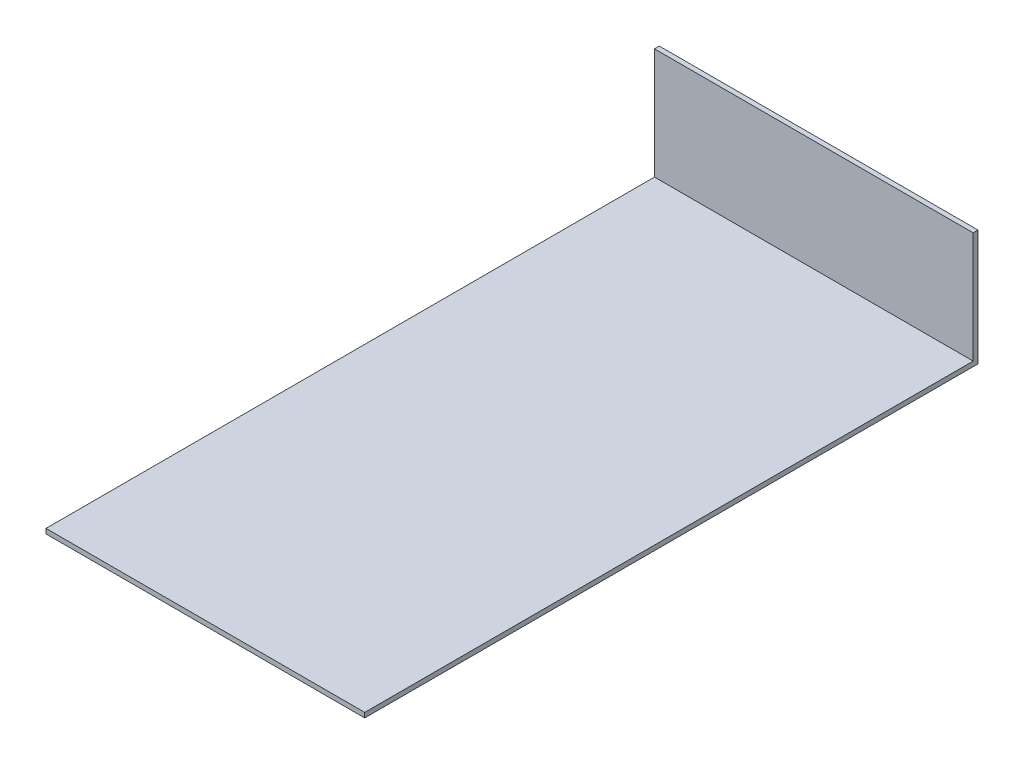
ISO-10303-21;
HEADER;
FILE_DESCRIPTION(('STEP AP214'),'2;1');
FILE_NAME('part.step','',(''),(''),'','','');
FILE_SCHEMA(('AUTOMOTIVE_DESIGN { 1 0 10303 214 1 1 1 1 }'));
ENDSEC;
DATA;
#1=APPLICATION_CONTEXT('core data for automotive mechanical design processes');
#2=APPLICATION_PROTOCOL_DEFINITION('international standard','automotive_design',2000,#1);
#3=PRODUCT_CONTEXT('',#1,'mechanical');
#4=PRODUCT('Part','Part','',(#3));
#5=PRODUCT_RELATED_PRODUCT_CATEGORY('part','',(#4));
#6=PRODUCT_DEFINITION_FORMATION('','',#4);
#7=PRODUCT_DEFINITION_CONTEXT('part definition',#1,'design');
#8=PRODUCT_DEFINITION('design','',#6,#7);
#9=PRODUCT_DEFINITION_SHAPE('','',#8);
#10=(LENGTH_UNIT() NAMED_UNIT(*) SI_UNIT(.MILLI.,.METRE.));
#11=(NAMED_UNIT(*) PLANE_ANGLE_UNIT() SI_UNIT($,.RADIAN.));
#12=(NAMED_UNIT(*) SI_UNIT($,.STERADIAN.) SOLID_ANGLE_UNIT());
#13=UNCERTAINTY_MEASURE_WITH_UNIT(LENGTH_MEASURE(1.E-05),#10,'distance_accuracy_value','');
#14=(GEOMETRIC_REPRESENTATION_CONTEXT(3) GLOBAL_UNCERTAINTY_ASSIGNED_CONTEXT((#13)) GLOBAL_UNIT_ASSIGNED_CONTEXT((#10,
#11,#12)) REPRESENTATION_CONTEXT('',''));
#15=CARTESIAN_POINT('',(0.,0.,0.));
#16=DIRECTION('',(0.,0.,1.));
#17=DIRECTION('',(1.,0.,0.));
#18=AXIS2_PLACEMENT_3D('',#15,#16,#17);
#19=CARTESIAN_POINT('',(66.,24.,-127.));
#20=DIRECTION('',(-1.,0.,0.));
#21=DIRECTION('',(0.,0.,1.));
#22=AXIS2_PLACEMENT_3D('',#19,#20,#21);
#23=PLANE('',#22);
#24=DIRECTION('',(0.,0.,-1.));
#25=VECTOR('',#24,1.);
#26=CARTESIAN_POINT('',(66.,-22.,-127.));
#27=LINE('',#26,#25);
#28=CARTESIAN_POINT('',(66.,-22.,127.));
#29=VERTEX_POINT('',#28);
#30=CARTESIAN_POINT('',(66.,-22.,-125.));
#31=VERTEX_POINT('',#30);
#32=EDGE_CURVE('E67',#29,#31,#27,.T.);
#33=ORIENTED_EDGE('',*,*,#32,.F.);
#34=DIRECTION('',(0.,-1.,0.));
#35=VECTOR('',#34,1.);
#36=CARTESIAN_POINT('',(66.,24.,127.));
#37=LINE('',#36,#35);
#38=CARTESIAN_POINT('',(66.,-24.,127.));
#39=VERTEX_POINT('',#38);
#40=EDGE_CURVE('E60',#29,#39,#37,.T.);
#41=ORIENTED_EDGE('',*,*,#40,.T.);
#42=DIRECTION('',(0.,0.,-1.));
#43=VECTOR('',#42,1.);
#44=CARTESIAN_POINT('',(66.,-24.,-127.));
#45=LINE('',#44,#43);
#46=CARTESIAN_POINT('',(66.,-24.,-127.));
#47=VERTEX_POINT('',#46);
#48=EDGE_CURVE('E64',#39,#47,#45,.T.);
#49=ORIENTED_EDGE('',*,*,#48,.T.);
#50=DIRECTION('',(0.,-1.,0.));
#51=VECTOR('',#50,1.);
#52=CARTESIAN_POINT('',(66.,24.,-127.));
#53=LINE('',#52,#51);
#54=CARTESIAN_POINT('',(66.,24.,-127.));
#55=VERTEX_POINT('',#54);
#56=EDGE_CURVE('E11',#55,#47,#53,.T.);
#57=ORIENTED_EDGE('',*,*,#56,.F.);
#58=DIRECTION('',(0.,0.,-1.));
#59=VECTOR('',#58,1.);
#60=CARTESIAN_POINT('',(66.,24.,-127.));
#61=LINE('',#60,#59);
#62=CARTESIAN_POINT('',(66.,24.,-125.));
#63=VERTEX_POINT('',#62);
#64=EDGE_CURVE('E80',#63,#55,#61,.T.);
#65=ORIENTED_EDGE('',*,*,#64,.F.);
#66=DIRECTION('',(0.,-1.,0.));
#67=VECTOR('',#66,1.);
#68=CARTESIAN_POINT('',(66.,24.,-125.));
#69=LINE('',#68,#67);
#70=EDGE_CURVE('E31',#63,#31,#69,.T.);
#71=ORIENTED_EDGE('',*,*,#70,.T.);
#72=EDGE_LOOP('',(#33,#41,#49,#57,#65,#71));
#73=FACE_BOUND('',#72,.T.);
#74=ADVANCED_FACE('F17',(#73),#23,.F.);
#75=CARTESIAN_POINT('',(-66.,24.,-127.));
#76=DIRECTION('',(1.,0.,0.));
#77=DIRECTION('',(0.,0.,-1.));
#78=AXIS2_PLACEMENT_3D('',#75,#76,#77);
#79=PLANE('',#78);
#80=DIRECTION('',(0.,0.,1.));
#81=VECTOR('',#80,1.);
#82=CARTESIAN_POINT('',(-66.,-22.,-127.));
#83=LINE('',#82,#81);
#84=CARTESIAN_POINT('',(-66.,-22.,-125.));
#85=VERTEX_POINT('',#84);
#86=CARTESIAN_POINT('',(-66.,-22.,127.));
#87=VERTEX_POINT('',#86);
#88=EDGE_CURVE('E118',#85,#87,#83,.T.);
#89=ORIENTED_EDGE('',*,*,#88,.F.);
#90=DIRECTION('',(0.,-1.,0.));
#91=VECTOR('',#90,1.);
#92=CARTESIAN_POINT('',(-66.,24.,-125.));
#93=LINE('',#92,#91);
#94=CARTESIAN_POINT('',(-66.,24.,-125.));
#95=VERTEX_POINT('',#94);
#96=EDGE_CURVE('E88',#95,#85,#93,.T.);
#97=ORIENTED_EDGE('',*,*,#96,.F.);
#98=DIRECTION('',(0.,0.,1.));
#99=VECTOR('',#98,1.);
#100=CARTESIAN_POINT('',(-66.,24.,-127.));
#101=LINE('',#100,#99);
#102=CARTESIAN_POINT('',(-66.,24.,-127.));
#103=VERTEX_POINT('',#102);
#104=EDGE_CURVE('E71',#103,#95,#101,.T.);
#105=ORIENTED_EDGE('',*,*,#104,.F.);
#106=DIRECTION('',(0.,-1.,0.));
#107=VECTOR('',#106,1.);
#108=CARTESIAN_POINT('',(-66.,24.,-127.));
#109=LINE('',#108,#107);
#110=CARTESIAN_POINT('',(-66.,-24.,-127.));
#111=VERTEX_POINT('',#110);
#112=EDGE_CURVE('E24',#103,#111,#109,.T.);
#113=ORIENTED_EDGE('',*,*,#112,.T.);
#114=DIRECTION('',(0.,0.,1.));
#115=VECTOR('',#114,1.);
#116=CARTESIAN_POINT('',(-66.,-24.,-127.));
#117=LINE('',#116,#115);
#118=CARTESIAN_POINT('',(-66.,-24.,127.));
#119=VERTEX_POINT('',#118);
#120=EDGE_CURVE('E81',#111,#119,#117,.T.);
#121=ORIENTED_EDGE('',*,*,#120,.T.);
#122=DIRECTION('',(0.,-1.,0.));
#123=VECTOR('',#122,1.);
#124=CARTESIAN_POINT('',(-66.,24.,127.));
#125=LINE('',#124,#123);
#126=EDGE_CURVE('E70',#87,#119,#125,.T.);
#127=ORIENTED_EDGE('',*,*,#126,.F.);
#128=EDGE_LOOP('',(#89,#97,#105,#113,#121,#127));
#129=FACE_BOUND('',#128,.T.);
#130=ADVANCED_FACE('F103',(#129),#79,.F.);
#131=CARTESIAN_POINT('',(-66.,24.,127.));
#132=DIRECTION('',(0.,0.,-1.));
#133=DIRECTION('',(-1.,0.,0.));
#134=AXIS2_PLACEMENT_3D('',#131,#132,#133);
#135=PLANE('',#134);
#136=DIRECTION('',(1.,0.,0.));
#137=VECTOR('',#136,1.);
#138=CARTESIAN_POINT('',(-66.,-22.,127.));
#139=LINE('',#138,#137);
#140=EDGE_CURVE('E112',#87,#29,#139,.T.);
#141=ORIENTED_EDGE('',*,*,#140,.F.);
#142=ORIENTED_EDGE('',*,*,#126,.T.);
#143=DIRECTION('',(1.,0.,0.));
#144=VECTOR('',#143,1.);
#145=CARTESIAN_POINT('',(-66.,-24.,127.));
#146=LINE('',#145,#144);
#147=EDGE_CURVE('E74',#119,#39,#146,.T.);
#148=ORIENTED_EDGE('',*,*,#147,.T.);
#149=ORIENTED_EDGE('',*,*,#40,.F.);
#150=EDGE_LOOP('',(#141,#142,#148,#149));
#151=FACE_BOUND('',#150,.T.);
#152=ADVANCED_FACE('F75',(#151),#135,.F.);
#153=CARTESIAN_POINT('',(-66.,24.,-127.));
#154=DIRECTION('',(0.,0.,1.));
#155=DIRECTION('',(1.,0.,0.));
#156=AXIS2_PLACEMENT_3D('',#153,#154,#155);
#157=PLANE('',#156);
#158=DIRECTION('',(-1.,0.,0.));
#159=VECTOR('',#158,1.);
#160=CARTESIAN_POINT('',(-66.,-24.,-127.));
#161=LINE('',#160,#159);
#162=EDGE_CURVE('E84',#47,#111,#161,.T.);
#163=ORIENTED_EDGE('',*,*,#162,.T.);
#164=ORIENTED_EDGE('',*,*,#112,.F.);
#165=DIRECTION('',(-1.,0.,0.));
#166=VECTOR('',#165,1.);
#167=CARTESIAN_POINT('',(-66.,24.,-127.));
#168=LINE('',#167,#166);
#169=EDGE_CURVE('E40',#55,#103,#168,.T.);
#170=ORIENTED_EDGE('',*,*,#169,.F.);
#171=ORIENTED_EDGE('',*,*,#56,.T.);
#172=EDGE_LOOP('',(#163,#164,#170,#171));
#173=FACE_BOUND('',#172,.T.);
#174=ADVANCED_FACE('F106',(#173),#157,.F.);
#175=CARTESIAN_POINT('',(0.,24.,0.));
#176=DIRECTION('',(0.,1.,0.));
#177=DIRECTION('',(0.,0.,1.));
#178=AXIS2_PLACEMENT_3D('',#175,#176,#177);
#179=PLANE('',#178);
#180=DIRECTION('',(-1.,0.,0.));
#181=VECTOR('',#180,1.);
#182=CARTESIAN_POINT('',(-66.,24.,-125.));
#183=LINE('',#182,#181);
#184=EDGE_CURVE('E111',#63,#95,#183,.T.);
#185=ORIENTED_EDGE('',*,*,#184,.F.);
#186=ORIENTED_EDGE('',*,*,#64,.T.);
#187=ORIENTED_EDGE('',*,*,#169,.T.);
#188=ORIENTED_EDGE('',*,*,#104,.T.);
#189=EDGE_LOOP('',(#185,#186,#187,#188));
#190=FACE_BOUND('',#189,.T.);
#191=ADVANCED_FACE('F134',(#190),#179,.T.);
#192=CARTESIAN_POINT('',(0.,-24.,0.));
#193=DIRECTION('',(0.,1.,0.));
#194=DIRECTION('',(0.,0.,1.));
#195=AXIS2_PLACEMENT_3D('',#192,#193,#194);
#196=PLANE('',#195);
#197=ORIENTED_EDGE('',*,*,#48,.F.);
#198=ORIENTED_EDGE('',*,*,#147,.F.);
#199=ORIENTED_EDGE('',*,*,#120,.F.);
#200=ORIENTED_EDGE('',*,*,#162,.F.);
#201=EDGE_LOOP('',(#197,#198,#199,#200));
#202=FACE_BOUND('',#201,.T.);
#203=ADVANCED_FACE('F83',(#202),#196,.F.);
#204=CARTESIAN_POINT('',(-66.,24.,-125.));
#205=DIRECTION('',(0.,0.,1.));
#206=DIRECTION('',(1.,0.,0.));
#207=AXIS2_PLACEMENT_3D('',#204,#205,#206);
#208=PLANE('',#207);
#209=DIRECTION('',(-1.,0.,0.));
#210=VECTOR('',#209,1.);
#211=CARTESIAN_POINT('',(-66.,-22.,-125.));
#212=LINE('',#211,#210);
#213=EDGE_CURVE('E115',#31,#85,#212,.T.);
#214=ORIENTED_EDGE('',*,*,#213,.F.);
#215=ORIENTED_EDGE('',*,*,#70,.F.);
#216=ORIENTED_EDGE('',*,*,#184,.T.);
#217=ORIENTED_EDGE('',*,*,#96,.T.);
#218=EDGE_LOOP('',(#214,#215,#216,#217));
#219=FACE_BOUND('',#218,.T.);
#220=ADVANCED_FACE('F130',(#219),#208,.T.);
#221=CARTESIAN_POINT('',(0.,-22.,0.));
#222=DIRECTION('',(0.,1.,0.));
#223=DIRECTION('',(0.,0.,1.));
#224=AXIS2_PLACEMENT_3D('',#221,#222,#223);
#225=PLANE('',#224);
#226=ORIENTED_EDGE('',*,*,#32,.T.);
#227=ORIENTED_EDGE('',*,*,#213,.T.);
#228=ORIENTED_EDGE('',*,*,#88,.T.);
#229=ORIENTED_EDGE('',*,*,#140,.T.);
#230=EDGE_LOOP('',(#226,#227,#228,#229));
#231=FACE_BOUND('',#230,.T.);
#232=ADVANCED_FACE('F127',(#231),#225,.T.);
#233=CLOSED_SHELL('',(#74,#130,#152,#174,#191,#203,#220,#232));
#234=MANIFOLD_SOLID_BREP('B1',#233);
#235=ADVANCED_BREP_SHAPE_REPRESENTATION('',(#18,#234),#14);
#236=SHAPE_DEFINITION_REPRESENTATION(#9,#235);
ENDSEC;
END-ISO-10303-21;
